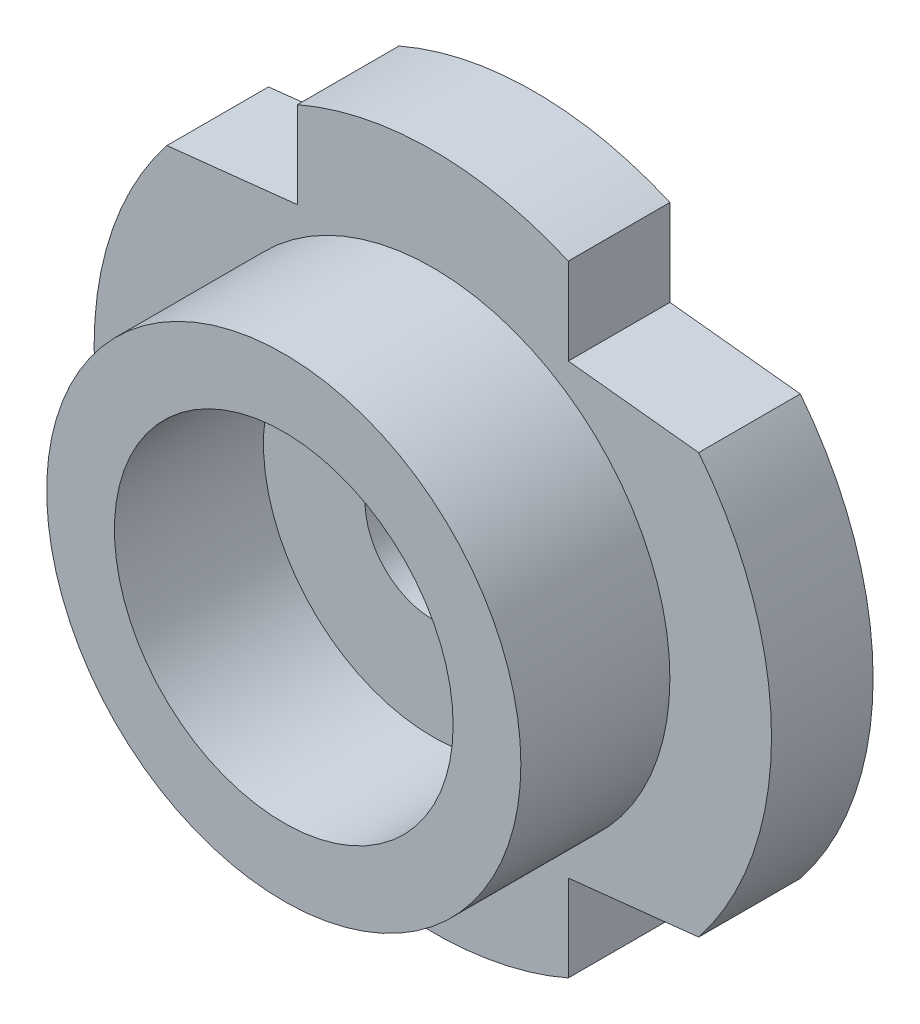
ISO-10303-21;
HEADER;
FILE_DESCRIPTION(('STEP AP214'),'2;1');
FILE_NAME('part.step','',(''),(''),'','','');
FILE_SCHEMA(('AUTOMOTIVE_DESIGN { 1 0 10303 214 1 1 1 1 }'));
ENDSEC;
DATA;
#1=APPLICATION_CONTEXT('core data for automotive mechanical design processes');
#2=APPLICATION_PROTOCOL_DEFINITION('international standard','automotive_design',2000,#1);
#3=PRODUCT_CONTEXT('',#1,'mechanical');
#4=PRODUCT('Part','Part','',(#3));
#5=PRODUCT_RELATED_PRODUCT_CATEGORY('part','',(#4));
#6=PRODUCT_DEFINITION_FORMATION('','',#4);
#7=PRODUCT_DEFINITION_CONTEXT('part definition',#1,'design');
#8=PRODUCT_DEFINITION('design','',#6,#7);
#9=PRODUCT_DEFINITION_SHAPE('','',#8);
#10=(LENGTH_UNIT() NAMED_UNIT(*) SI_UNIT(.MILLI.,.METRE.));
#11=(NAMED_UNIT(*) PLANE_ANGLE_UNIT() SI_UNIT($,.RADIAN.));
#12=(NAMED_UNIT(*) SI_UNIT($,.STERADIAN.) SOLID_ANGLE_UNIT());
#13=UNCERTAINTY_MEASURE_WITH_UNIT(LENGTH_MEASURE(1.E-05),#10,'distance_accuracy_value','');
#14=(GEOMETRIC_REPRESENTATION_CONTEXT(3) GLOBAL_UNCERTAINTY_ASSIGNED_CONTEXT((#13)) GLOBAL_UNIT_ASSIGNED_CONTEXT((#10,
#11,#12)) REPRESENTATION_CONTEXT('',''));
#15=CARTESIAN_POINT('',(0.,0.,0.));
#16=DIRECTION('',(0.,0.,1.));
#17=DIRECTION('',(1.,0.,0.));
#18=AXIS2_PLACEMENT_3D('',#15,#16,#17);
#19=CARTESIAN_POINT('',(-2.,-7.75863864960814,1.5));
#20=DIRECTION('',(1.,0.,0.));
#21=DIRECTION('',(0.,1.,0.));
#22=AXIS2_PLACEMENT_3D('',#19,#20,#21);
#23=PLANE('',#22);
#24=DIRECTION('',(0.,0.,1.));
#25=VECTOR('',#24,1.);
#26=CARTESIAN_POINT('',(-2.,-4.58257569495584,-0.000999999999999916));
#27=LINE('',#26,#25);
#28=CARTESIAN_POINT('',(-2.,-4.58257569495584,0.));
#29=VERTEX_POINT('',#28);
#30=CARTESIAN_POINT('',(-2.,-4.58257569495584,1.5));
#31=VERTEX_POINT('',#30);
#32=EDGE_CURVE('E124',#29,#31,#27,.T.);
#33=ORIENTED_EDGE('',*,*,#32,.T.);
#34=DIRECTION('',(0.,-1.,0.));
#35=VECTOR('',#34,1.);
#36=CARTESIAN_POINT('',(-2.,-7.75863864960814,1.5));
#37=LINE('',#36,#35);
#38=CARTESIAN_POINT('',(-2.,-3.30473755729266,1.5));
#39=VERTEX_POINT('',#38);
#40=EDGE_CURVE('E238',#39,#31,#37,.T.);
#41=ORIENTED_EDGE('',*,*,#40,.F.);
#42=DIRECTION('',(0.,0.,-1.));
#43=VECTOR('',#42,1.);
#44=CARTESIAN_POINT('',(-2.,-3.30473755729266,1.5));
#45=LINE('',#44,#43);
#46=CARTESIAN_POINT('',(-2.,-3.30473755729266,0.));
#47=VERTEX_POINT('',#46);
#48=EDGE_CURVE('E145',#39,#47,#45,.T.);
#49=ORIENTED_EDGE('',*,*,#48,.T.);
#50=DIRECTION('',(0.,-1.,0.));
#51=VECTOR('',#50,1.);
#52=CARTESIAN_POINT('',(-2.,-7.75863864960814,0.));
#53=LINE('',#52,#51);
#54=EDGE_CURVE('E139',#47,#29,#53,.T.);
#55=ORIENTED_EDGE('',*,*,#54,.T.);
#56=EDGE_LOOP('',(#33,#41,#49,#55));
#57=FACE_BOUND('',#56,.T.);
#58=ADVANCED_FACE('F36',(#57),#23,.F.);
#59=CARTESIAN_POINT('',(2.,-7.75863864960814,1.5));
#60=DIRECTION('',(-1.,0.,0.));
#61=DIRECTION('',(0.,-1.,0.));
#62=AXIS2_PLACEMENT_3D('',#59,#60,#61);
#63=PLANE('',#62);
#64=DIRECTION('',(0.,0.,1.));
#65=VECTOR('',#64,1.);
#66=CARTESIAN_POINT('',(2.,-4.58257569495584,-0.000999999999999916));
#67=LINE('',#66,#65);
#68=CARTESIAN_POINT('',(2.,-4.58257569495584,1.5));
#69=VERTEX_POINT('',#68);
#70=CARTESIAN_POINT('',(2.,-4.58257569495584,0.));
#71=VERTEX_POINT('',#70);
#72=EDGE_CURVE('E258',#69,#71,#67,.F.);
#73=ORIENTED_EDGE('',*,*,#72,.T.);
#74=DIRECTION('',(0.,1.,0.));
#75=VECTOR('',#74,1.);
#76=CARTESIAN_POINT('',(2.,-7.75863864960814,0.));
#77=LINE('',#76,#75);
#78=CARTESIAN_POINT('',(2.,-3.30473755729266,0.));
#79=VERTEX_POINT('',#78);
#80=EDGE_CURVE('E141',#71,#79,#77,.T.);
#81=ORIENTED_EDGE('',*,*,#80,.T.);
#82=DIRECTION('',(0.,0.,-1.));
#83=VECTOR('',#82,1.);
#84=CARTESIAN_POINT('',(2.,-3.30473755729266,1.5));
#85=LINE('',#84,#83);
#86=CARTESIAN_POINT('',(2.,-3.30473755729266,1.5));
#87=VERTEX_POINT('',#86);
#88=EDGE_CURVE('E157',#87,#79,#85,.T.);
#89=ORIENTED_EDGE('',*,*,#88,.F.);
#90=DIRECTION('',(0.,1.,0.));
#91=VECTOR('',#90,1.);
#92=CARTESIAN_POINT('',(2.,-7.75863864960814,1.5));
#93=LINE('',#92,#91);
#94=EDGE_CURVE('E240',#69,#87,#93,.T.);
#95=ORIENTED_EDGE('',*,*,#94,.F.);
#96=EDGE_LOOP('',(#73,#81,#89,#95));
#97=FACE_BOUND('',#96,.T.);
#98=ADVANCED_FACE('F273',(#97),#63,.F.);
#99=CARTESIAN_POINT('',(14.,0.,1.5));
#100=DIRECTION('',(0.,0.,1.));
#101=DIRECTION('',(1.,0.,0.));
#102=AXIS2_PLACEMENT_3D('',#99,#100,#101);
#103=PLANE('',#102);
#104=CARTESIAN_POINT('',(0.,0.,1.5));
#105=DIRECTION('',(0.,0.,1.));
#106=DIRECTION('',(1.,0.,0.));
#107=AXIS2_PLACEMENT_3D('',#104,#105,#106);
#108=CIRCLE('',#107,3.5);
#109=CARTESIAN_POINT('',(3.5,0.,1.5));
#110=VERTEX_POINT('',#109);
#111=EDGE_CURVE('E225',#110,#110,#108,.T.);
#112=ORIENTED_EDGE('',*,*,#111,.F.);
#113=EDGE_LOOP('',(#112));
#114=FACE_BOUND('',#113,.T.);
#115=ORIENTED_EDGE('',*,*,#40,.T.);
#116=CARTESIAN_POINT('',(0.,0.,1.5));
#117=DIRECTION('',(0.,0.,1.));
#118=DIRECTION('',(1.,0.,0.));
#119=AXIS2_PLACEMENT_3D('',#116,#117,#118);
#120=CIRCLE('',#119,5.);
#121=EDGE_CURVE('E127',#31,#69,#120,.T.);
#122=ORIENTED_EDGE('',*,*,#121,.T.);
#123=ORIENTED_EDGE('',*,*,#94,.T.);
#124=DIRECTION('',(0.994243636219647,0.107142857142857,0.));
#125=VECTOR('',#124,1.);
#126=CARTESIAN_POINT('',(2.,-3.30473755729266,1.5));
#127=LINE('',#126,#125);
#128=CARTESIAN_POINT('',(3.9251598842984,-3.09727620381111,1.5));
#129=VERTEX_POINT('',#128);
#130=EDGE_CURVE('E160',#87,#129,#127,.T.);
#131=ORIENTED_EDGE('',*,*,#130,.T.);
#132=CARTESIAN_POINT('',(0.,0.,1.5));
#133=DIRECTION('',(0.,0.,1.));
#134=DIRECTION('',(1.,0.,0.));
#135=AXIS2_PLACEMENT_3D('',#132,#133,#134);
#136=CIRCLE('',#135,5.);
#137=CARTESIAN_POINT('',(3.9251598842984,3.09727620381111,1.5));
#138=VERTEX_POINT('',#137);
#139=EDGE_CURVE('E60',#129,#138,#136,.T.);
#140=ORIENTED_EDGE('',*,*,#139,.T.);
#141=DIRECTION('',(-0.994243636219647,0.107142857142857,0.));
#142=VECTOR('',#141,1.);
#143=CARTESIAN_POINT('',(2.,3.30473755729266,1.5));
#144=LINE('',#143,#142);
#145=CARTESIAN_POINT('',(2.,3.30473755729266,1.5));
#146=VERTEX_POINT('',#145);
#147=EDGE_CURVE('E156',#138,#146,#144,.T.);
#148=ORIENTED_EDGE('',*,*,#147,.T.);
#149=DIRECTION('',(0.,1.,0.));
#150=VECTOR('',#149,1.);
#151=CARTESIAN_POINT('',(2.,7.75863864960814,1.5));
#152=LINE('',#151,#150);
#153=CARTESIAN_POINT('',(2.,4.58257569495584,1.5));
#154=VERTEX_POINT('',#153);
#155=EDGE_CURVE('E175',#146,#154,#152,.T.);
#156=ORIENTED_EDGE('',*,*,#155,.T.);
#157=CARTESIAN_POINT('',(0.,0.,1.5));
#158=DIRECTION('',(0.,0.,1.));
#159=DIRECTION('',(1.,0.,0.));
#160=AXIS2_PLACEMENT_3D('',#157,#158,#159);
#161=CIRCLE('',#160,5.);
#162=CARTESIAN_POINT('',(-2.,4.58257569495584,1.5));
#163=VERTEX_POINT('',#162);
#164=EDGE_CURVE('E261',#154,#163,#161,.T.);
#165=ORIENTED_EDGE('',*,*,#164,.T.);
#166=DIRECTION('',(0.,-1.,0.));
#167=VECTOR('',#166,1.);
#168=CARTESIAN_POINT('',(-2.,7.75863864960814,1.5));
#169=LINE('',#168,#167);
#170=CARTESIAN_POINT('',(-2.,3.30473755729266,1.5));
#171=VERTEX_POINT('',#170);
#172=EDGE_CURVE('E232',#163,#171,#169,.T.);
#173=ORIENTED_EDGE('',*,*,#172,.T.);
#174=DIRECTION('',(-0.994243636219647,-0.107142857142857,0.));
#175=VECTOR('',#174,1.);
#176=CARTESIAN_POINT('',(-2.,3.30473755729266,1.5));
#177=LINE('',#176,#175);
#178=CARTESIAN_POINT('',(-3.9251598842984,3.09727620381111,1.5));
#179=VERTEX_POINT('',#178);
#180=EDGE_CURVE('E234',#171,#179,#177,.T.);
#181=ORIENTED_EDGE('',*,*,#180,.T.);
#182=CARTESIAN_POINT('',(0.,0.,1.5));
#183=DIRECTION('',(0.,0.,1.));
#184=DIRECTION('',(1.,0.,0.));
#185=AXIS2_PLACEMENT_3D('',#182,#183,#184);
#186=CIRCLE('',#185,5.);
#187=CARTESIAN_POINT('',(-3.9251598842984,-3.09727620381111,1.5));
#188=VERTEX_POINT('',#187);
#189=EDGE_CURVE('E204',#179,#188,#186,.T.);
#190=ORIENTED_EDGE('',*,*,#189,.T.);
#191=DIRECTION('',(0.994243636219647,-0.107142857142857,0.));
#192=VECTOR('',#191,1.);
#193=CARTESIAN_POINT('',(-2.,-3.30473755729266,1.5));
#194=LINE('',#193,#192);
#195=EDGE_CURVE('E236',#188,#39,#194,.T.);
#196=ORIENTED_EDGE('',*,*,#195,.T.);
#197=EDGE_LOOP('',(#115,#122,#123,#131,#140,#148,#156,#165,#173,#181,#190,#196));
#198=FACE_BOUND('',#197,.T.);
#199=ADVANCED_FACE('F244',(#114,#198),#103,.T.);
#200=CARTESIAN_POINT('',(14.,0.,0.));
#201=DIRECTION('',(0.,0.,1.));
#202=DIRECTION('',(1.,0.,0.));
#203=AXIS2_PLACEMENT_3D('',#200,#201,#202);
#204=PLANE('',#203);
#205=CARTESIAN_POINT('',(0.,0.,0.));
#206=DIRECTION('',(0.,0.,1.));
#207=DIRECTION('',(1.,0.,0.));
#208=AXIS2_PLACEMENT_3D('',#205,#206,#207);
#209=CIRCLE('',#208,5.);
#210=EDGE_CURVE('E52',#71,#29,#209,.F.);
#211=ORIENTED_EDGE('',*,*,#210,.T.);
#212=ORIENTED_EDGE('',*,*,#54,.F.);
#213=DIRECTION('',(0.994243636219647,-0.107142857142857,0.));
#214=VECTOR('',#213,1.);
#215=CARTESIAN_POINT('',(-2.,-3.30473755729266,0.));
#216=LINE('',#215,#214);
#217=CARTESIAN_POINT('',(-3.9251598842984,-3.09727620381111,0.));
#218=VERTEX_POINT('',#217);
#219=EDGE_CURVE('E146',#218,#47,#216,.T.);
#220=ORIENTED_EDGE('',*,*,#219,.F.);
#221=CARTESIAN_POINT('',(0.,0.,0.));
#222=DIRECTION('',(0.,0.,1.));
#223=DIRECTION('',(1.,0.,0.));
#224=AXIS2_PLACEMENT_3D('',#221,#222,#223);
#225=CIRCLE('',#224,5.);
#226=CARTESIAN_POINT('',(-3.9251598842984,3.09727620381111,0.));
#227=VERTEX_POINT('',#226);
#228=EDGE_CURVE('E200',#218,#227,#225,.F.);
#229=ORIENTED_EDGE('',*,*,#228,.T.);
#230=DIRECTION('',(-0.994243636219647,-0.107142857142857,0.));
#231=VECTOR('',#230,1.);
#232=CARTESIAN_POINT('',(-2.,3.30473755729266,0.));
#233=LINE('',#232,#231);
#234=CARTESIAN_POINT('',(-2.,3.30473755729266,0.));
#235=VERTEX_POINT('',#234);
#236=EDGE_CURVE('E150',#235,#227,#233,.T.);
#237=ORIENTED_EDGE('',*,*,#236,.F.);
#238=DIRECTION('',(0.,-1.,0.));
#239=VECTOR('',#238,1.);
#240=CARTESIAN_POINT('',(-2.,7.75863864960814,0.));
#241=LINE('',#240,#239);
#242=CARTESIAN_POINT('',(-2.,4.58257569495584,0.));
#243=VERTEX_POINT('',#242);
#244=EDGE_CURVE('E184',#243,#235,#241,.T.);
#245=ORIENTED_EDGE('',*,*,#244,.F.);
#246=CARTESIAN_POINT('',(0.,0.,0.));
#247=DIRECTION('',(0.,0.,1.));
#248=DIRECTION('',(1.,0.,0.));
#249=AXIS2_PLACEMENT_3D('',#246,#247,#248);
#250=CIRCLE('',#249,5.);
#251=CARTESIAN_POINT('',(2.,4.58257569495584,0.));
#252=VERTEX_POINT('',#251);
#253=EDGE_CURVE('E183',#243,#252,#250,.F.);
#254=ORIENTED_EDGE('',*,*,#253,.T.);
#255=DIRECTION('',(0.,1.,0.));
#256=VECTOR('',#255,1.);
#257=CARTESIAN_POINT('',(2.,7.75863864960814,0.));
#258=LINE('',#257,#256);
#259=CARTESIAN_POINT('',(2.,3.30473755729266,0.));
#260=VERTEX_POINT('',#259);
#261=EDGE_CURVE('E173',#260,#252,#258,.T.);
#262=ORIENTED_EDGE('',*,*,#261,.F.);
#263=DIRECTION('',(-0.994243636219647,0.107142857142857,0.));
#264=VECTOR('',#263,1.);
#265=CARTESIAN_POINT('',(2.,3.30473755729266,0.));
#266=LINE('',#265,#264);
#267=CARTESIAN_POINT('',(3.9251598842984,3.09727620381111,0.));
#268=VERTEX_POINT('',#267);
#269=EDGE_CURVE('E181',#268,#260,#266,.T.);
#270=ORIENTED_EDGE('',*,*,#269,.F.);
#271=CARTESIAN_POINT('',(0.,0.,0.));
#272=DIRECTION('',(0.,0.,1.));
#273=DIRECTION('',(1.,0.,0.));
#274=AXIS2_PLACEMENT_3D('',#271,#272,#273);
#275=CIRCLE('',#274,5.);
#276=CARTESIAN_POINT('',(3.9251598842984,-3.09727620381111,0.));
#277=VERTEX_POINT('',#276);
#278=EDGE_CURVE('E250',#268,#277,#275,.F.);
#279=ORIENTED_EDGE('',*,*,#278,.T.);
#280=DIRECTION('',(0.994243636219647,0.107142857142857,0.));
#281=VECTOR('',#280,1.);
#282=CARTESIAN_POINT('',(2.,-3.30473755729266,0.));
#283=LINE('',#282,#281);
#284=EDGE_CURVE('E148',#79,#277,#283,.T.);
#285=ORIENTED_EDGE('',*,*,#284,.F.);
#286=ORIENTED_EDGE('',*,*,#80,.F.);
#287=EDGE_LOOP('',(#211,#212,#220,#229,#237,#245,#254,#262,#270,#279,#285,#286));
#288=FACE_BOUND('',#287,.T.);
#289=CARTESIAN_POINT('',(0.,0.,0.));
#290=DIRECTION('',(0.,0.,-1.));
#291=DIRECTION('',(-1.,0.,0.));
#292=AXIS2_PLACEMENT_3D('',#289,#290,#291);
#293=CIRCLE('',#292,2.5);
#294=CARTESIAN_POINT('',(-2.5,0.,0.));
#295=VERTEX_POINT('',#294);
#296=EDGE_CURVE('E213',#295,#295,#293,.T.);
#297=ORIENTED_EDGE('',*,*,#296,.F.);
#298=EDGE_LOOP('',(#297));
#299=FACE_BOUND('',#298,.T.);
#300=ADVANCED_FACE('F136',(#288,#299),#204,.F.);
#301=CARTESIAN_POINT('',(2.,3.30473755729266,1.5));
#302=DIRECTION('',(-0.107142857142857,-0.994243636219647,0.));
#303=DIRECTION('',(0.994243636219647,-0.107142857142857,0.));
#304=AXIS2_PLACEMENT_3D('',#301,#302,#303);
#305=PLANE('',#304);
#306=DIRECTION('',(0.,0.,1.));
#307=VECTOR('',#306,1.);
#308=CARTESIAN_POINT('',(3.9251598842984,3.09727620381111,-0.000999999999999916));
#309=LINE('',#308,#307);
#310=EDGE_CURVE('E253',#138,#268,#309,.F.);
#311=ORIENTED_EDGE('',*,*,#310,.T.);
#312=ORIENTED_EDGE('',*,*,#269,.T.);
#313=DIRECTION('',(0.,0.,-1.));
#314=VECTOR('',#313,1.);
#315=CARTESIAN_POINT('',(2.,3.30473755729266,1.5));
#316=LINE('',#315,#314);
#317=EDGE_CURVE('E45',#146,#260,#316,.T.);
#318=ORIENTED_EDGE('',*,*,#317,.F.);
#319=ORIENTED_EDGE('',*,*,#147,.F.);
#320=EDGE_LOOP('',(#311,#312,#318,#319));
#321=FACE_BOUND('',#320,.T.);
#322=ADVANCED_FACE('F38',(#321),#305,.F.);
#323=CARTESIAN_POINT('',(2.,-3.30473755729266,1.5));
#324=DIRECTION('',(-0.107142857142857,0.994243636219647,0.));
#325=DIRECTION('',(-0.994243636219647,-0.107142857142857,0.));
#326=AXIS2_PLACEMENT_3D('',#323,#324,#325);
#327=PLANE('',#326);
#328=DIRECTION('',(0.,0.,1.));
#329=VECTOR('',#328,1.);
#330=CARTESIAN_POINT('',(3.9251598842984,-3.09727620381111,-0.000999999999999916));
#331=LINE('',#330,#329);
#332=EDGE_CURVE('E249',#277,#129,#331,.T.);
#333=ORIENTED_EDGE('',*,*,#332,.T.);
#334=ORIENTED_EDGE('',*,*,#130,.F.);
#335=ORIENTED_EDGE('',*,*,#88,.T.);
#336=ORIENTED_EDGE('',*,*,#284,.T.);
#337=EDGE_LOOP('',(#333,#334,#335,#336));
#338=FACE_BOUND('',#337,.T.);
#339=ADVANCED_FACE('F248',(#338),#327,.F.);
#340=CARTESIAN_POINT('',(2.,7.75863864960814,1.5));
#341=DIRECTION('',(-1.,0.,0.));
#342=DIRECTION('',(0.,-1.,0.));
#343=AXIS2_PLACEMENT_3D('',#340,#341,#342);
#344=PLANE('',#343);
#345=DIRECTION('',(0.,0.,1.));
#346=VECTOR('',#345,1.);
#347=CARTESIAN_POINT('',(2.,4.58257569495584,-0.000999999999999916));
#348=LINE('',#347,#346);
#349=EDGE_CURVE('E252',#252,#154,#348,.T.);
#350=ORIENTED_EDGE('',*,*,#349,.T.);
#351=ORIENTED_EDGE('',*,*,#155,.F.);
#352=ORIENTED_EDGE('',*,*,#317,.T.);
#353=ORIENTED_EDGE('',*,*,#261,.T.);
#354=EDGE_LOOP('',(#350,#351,#352,#353));
#355=FACE_BOUND('',#354,.T.);
#356=ADVANCED_FACE('F172',(#355),#344,.F.);
#357=CARTESIAN_POINT('',(-2.,7.75863864960814,1.5));
#358=DIRECTION('',(1.,0.,0.));
#359=DIRECTION('',(0.,1.,0.));
#360=AXIS2_PLACEMENT_3D('',#357,#358,#359);
#361=PLANE('',#360);
#362=DIRECTION('',(0.,0.,1.));
#363=VECTOR('',#362,1.);
#364=CARTESIAN_POINT('',(-2.,4.58257569495584,-0.000999999999999916));
#365=LINE('',#364,#363);
#366=EDGE_CURVE('E208',#163,#243,#365,.F.);
#367=ORIENTED_EDGE('',*,*,#366,.T.);
#368=ORIENTED_EDGE('',*,*,#244,.T.);
#369=DIRECTION('',(0.,0.,-1.));
#370=VECTOR('',#369,1.);
#371=CARTESIAN_POINT('',(-2.,3.30473755729266,1.5));
#372=LINE('',#371,#370);
#373=EDGE_CURVE('E162',#171,#235,#372,.T.);
#374=ORIENTED_EDGE('',*,*,#373,.F.);
#375=ORIENTED_EDGE('',*,*,#172,.F.);
#376=EDGE_LOOP('',(#367,#368,#374,#375));
#377=FACE_BOUND('',#376,.T.);
#378=ADVANCED_FACE('F268',(#377),#361,.F.);
#379=CARTESIAN_POINT('',(-2.,3.30473755729266,1.5));
#380=DIRECTION('',(0.107142857142857,-0.994243636219647,0.));
#381=DIRECTION('',(0.994243636219647,0.107142857142857,0.));
#382=AXIS2_PLACEMENT_3D('',#379,#380,#381);
#383=PLANE('',#382);
#384=DIRECTION('',(0.,0.,1.));
#385=VECTOR('',#384,1.);
#386=CARTESIAN_POINT('',(-3.9251598842984,3.09727620381111,-0.000999999999999916));
#387=LINE('',#386,#385);
#388=EDGE_CURVE('E196',#227,#179,#387,.T.);
#389=ORIENTED_EDGE('',*,*,#388,.T.);
#390=ORIENTED_EDGE('',*,*,#180,.F.);
#391=ORIENTED_EDGE('',*,*,#373,.T.);
#392=ORIENTED_EDGE('',*,*,#236,.T.);
#393=EDGE_LOOP('',(#389,#390,#391,#392));
#394=FACE_BOUND('',#393,.T.);
#395=ADVANCED_FACE('F194',(#394),#383,.F.);
#396=CARTESIAN_POINT('',(-2.,-3.30473755729266,1.5));
#397=DIRECTION('',(0.107142857142857,0.994243636219647,0.));
#398=DIRECTION('',(-0.994243636219647,0.107142857142857,0.));
#399=AXIS2_PLACEMENT_3D('',#396,#397,#398);
#400=PLANE('',#399);
#401=DIRECTION('',(0.,0.,1.));
#402=VECTOR('',#401,1.);
#403=CARTESIAN_POINT('',(-3.9251598842984,-3.09727620381111,-0.000999999999999916));
#404=LINE('',#403,#402);
#405=EDGE_CURVE('E203',#188,#218,#404,.F.);
#406=ORIENTED_EDGE('',*,*,#405,.T.);
#407=ORIENTED_EDGE('',*,*,#219,.T.);
#408=ORIENTED_EDGE('',*,*,#48,.F.);
#409=ORIENTED_EDGE('',*,*,#195,.F.);
#410=EDGE_LOOP('',(#406,#407,#408,#409));
#411=FACE_BOUND('',#410,.T.);
#412=ADVANCED_FACE('F271',(#411),#400,.F.);
#413=CARTESIAN_POINT('',(0.,0.,-0.000999999999999916));
#414=DIRECTION('',(0.,0.,1.));
#415=DIRECTION('',(1.,0.,0.));
#416=AXIS2_PLACEMENT_3D('',#413,#414,#415);
#417=CYLINDRICAL_SURFACE('',#416,1.);
#418=CARTESIAN_POINT('',(0.,0.,1.5));
#419=DIRECTION('',(0.,0.,1.));
#420=DIRECTION('',(1.,0.,0.));
#421=AXIS2_PLACEMENT_3D('',#418,#419,#420);
#422=CIRCLE('',#421,1.);
#423=CARTESIAN_POINT('',(1.,0.,1.5));
#424=VERTEX_POINT('',#423);
#425=EDGE_CURVE('E219',#424,#424,#422,.T.);
#426=ORIENTED_EDGE('',*,*,#425,.T.);
#427=EDGE_LOOP('',(#426));
#428=FACE_BOUND('',#427,.T.);
#429=CARTESIAN_POINT('',(0.,0.,1.));
#430=DIRECTION('',(0.,0.,-1.));
#431=DIRECTION('',(-1.,0.,0.));
#432=AXIS2_PLACEMENT_3D('',#429,#430,#431);
#433=CIRCLE('',#432,1.);
#434=CARTESIAN_POINT('',(-1.,0.,1.));
#435=VERTEX_POINT('',#434);
#436=EDGE_CURVE('E40',#435,#435,#433,.F.);
#437=ORIENTED_EDGE('',*,*,#436,.F.);
#438=EDGE_LOOP('',(#437));
#439=FACE_BOUND('',#438,.T.);
#440=ADVANCED_FACE('F290',(#428,#439),#417,.F.);
#441=CARTESIAN_POINT('',(0.,0.,3.7));
#442=DIRECTION('',(0.,0.,1.));
#443=DIRECTION('',(1.,0.,0.));
#444=AXIS2_PLACEMENT_3D('',#441,#442,#443);
#445=PLANE('',#444);
#446=CARTESIAN_POINT('',(0.,0.,3.7));
#447=DIRECTION('',(0.,0.,1.));
#448=DIRECTION('',(1.,0.,0.));
#449=AXIS2_PLACEMENT_3D('',#446,#447,#448);
#450=CIRCLE('',#449,3.5);
#451=CARTESIAN_POINT('',(3.5,0.,3.7));
#452=VERTEX_POINT('',#451);
#453=EDGE_CURVE('E187',#452,#452,#450,.T.);
#454=ORIENTED_EDGE('',*,*,#453,.T.);
#455=EDGE_LOOP('',(#454));
#456=FACE_BOUND('',#455,.T.);
#457=CARTESIAN_POINT('',(0.,0.,3.7));
#458=DIRECTION('',(0.,0.,1.));
#459=DIRECTION('',(1.,0.,0.));
#460=AXIS2_PLACEMENT_3D('',#457,#458,#459);
#461=CIRCLE('',#460,2.5);
#462=CARTESIAN_POINT('',(2.5,0.,3.7));
#463=VERTEX_POINT('',#462);
#464=EDGE_CURVE('E222',#463,#463,#461,.T.);
#465=ORIENTED_EDGE('',*,*,#464,.F.);
#466=EDGE_LOOP('',(#465));
#467=FACE_BOUND('',#466,.T.);
#468=ADVANCED_FACE('F329',(#456,#467),#445,.T.);
#469=CARTESIAN_POINT('',(0.,0.,3.7));
#470=DIRECTION('',(0.,0.,-1.));
#471=DIRECTION('',(-1.,0.,0.));
#472=AXIS2_PLACEMENT_3D('',#469,#470,#471);
#473=CYLINDRICAL_SURFACE('',#472,3.5);
#474=ORIENTED_EDGE('',*,*,#453,.F.);
#475=EDGE_LOOP('',(#474));
#476=FACE_BOUND('',#475,.T.);
#477=ORIENTED_EDGE('',*,*,#111,.T.);
#478=EDGE_LOOP('',(#477));
#479=FACE_BOUND('',#478,.T.);
#480=ADVANCED_FACE('F334',(#476,#479),#473,.T.);
#481=CARTESIAN_POINT('',(0.,0.,3.7));
#482=DIRECTION('',(0.,0.,-1.));
#483=DIRECTION('',(-1.,0.,0.));
#484=AXIS2_PLACEMENT_3D('',#481,#482,#483);
#485=CYLINDRICAL_SURFACE('',#484,2.5);
#486=ORIENTED_EDGE('',*,*,#464,.T.);
#487=EDGE_LOOP('',(#486));
#488=FACE_BOUND('',#487,.T.);
#489=CARTESIAN_POINT('',(0.,0.,1.5));
#490=DIRECTION('',(0.,0.,1.));
#491=DIRECTION('',(1.,0.,0.));
#492=AXIS2_PLACEMENT_3D('',#489,#490,#491);
#493=CIRCLE('',#492,2.5);
#494=CARTESIAN_POINT('',(2.5,0.,1.5));
#495=VERTEX_POINT('',#494);
#496=EDGE_CURVE('E11',#495,#495,#493,.F.);
#497=ORIENTED_EDGE('',*,*,#496,.T.);
#498=EDGE_LOOP('',(#497));
#499=FACE_BOUND('',#498,.T.);
#500=ADVANCED_FACE('F331',(#488,#499),#485,.F.);
#501=ORIENTED_EDGE('',*,*,#425,.F.);
#502=EDGE_LOOP('',(#501));
#503=FACE_BOUND('',#502,.T.);
#504=ORIENTED_EDGE('',*,*,#496,.F.);
#505=EDGE_LOOP('',(#504));
#506=FACE_BOUND('',#505,.T.);
#507=ADVANCED_FACE('F283',(#503,#506),#103,.T.);
#508=CARTESIAN_POINT('',(0.,0.,1.));
#509=DIRECTION('',(0.,0.,-1.));
#510=DIRECTION('',(-1.,0.,0.));
#511=AXIS2_PLACEMENT_3D('',#508,#509,#510);
#512=PLANE('',#511);
#513=CARTESIAN_POINT('',(0.,0.,1.));
#514=DIRECTION('',(0.,0.,-1.));
#515=DIRECTION('',(-1.,0.,0.));
#516=AXIS2_PLACEMENT_3D('',#513,#514,#515);
#517=CIRCLE('',#516,2.5);
#518=CARTESIAN_POINT('',(-2.5,0.,1.));
#519=VERTEX_POINT('',#518);
#520=EDGE_CURVE('E214',#519,#519,#517,.T.);
#521=ORIENTED_EDGE('',*,*,#520,.T.);
#522=EDGE_LOOP('',(#521));
#523=FACE_BOUND('',#522,.T.);
#524=ORIENTED_EDGE('',*,*,#436,.T.);
#525=EDGE_LOOP('',(#524));
#526=FACE_BOUND('',#525,.T.);
#527=ADVANCED_FACE('F320',(#523,#526),#512,.T.);
#528=CARTESIAN_POINT('',(0.,0.,1.));
#529=DIRECTION('',(0.,0.,-1.));
#530=DIRECTION('',(-1.,0.,0.));
#531=AXIS2_PLACEMENT_3D('',#528,#529,#530);
#532=CYLINDRICAL_SURFACE('',#531,2.5);
#533=ORIENTED_EDGE('',*,*,#520,.F.);
#534=EDGE_LOOP('',(#533));
#535=FACE_BOUND('',#534,.T.);
#536=ORIENTED_EDGE('',*,*,#296,.T.);
#537=EDGE_LOOP('',(#536));
#538=FACE_BOUND('',#537,.T.);
#539=ADVANCED_FACE('F319',(#535,#538),#532,.F.);
#540=CARTESIAN_POINT('',(0.,0.,-0.000999999999999916));
#541=DIRECTION('',(0.,0.,1.));
#542=DIRECTION('',(1.,0.,0.));
#543=AXIS2_PLACEMENT_3D('',#540,#541,#542);
#544=CYLINDRICAL_SURFACE('',#543,5.);
#545=ORIENTED_EDGE('',*,*,#228,.F.);
#546=ORIENTED_EDGE('',*,*,#405,.F.);
#547=ORIENTED_EDGE('',*,*,#189,.F.);
#548=ORIENTED_EDGE('',*,*,#388,.F.);
#549=EDGE_LOOP('',(#545,#546,#547,#548));
#550=FACE_BOUND('',#549,.T.);
#551=ADVANCED_FACE('F314',(#550),#544,.T.);
#552=CARTESIAN_POINT('',(0.,0.,-0.000999999999999916));
#553=DIRECTION('',(0.,0.,1.));
#554=DIRECTION('',(1.,0.,0.));
#555=AXIS2_PLACEMENT_3D('',#552,#553,#554);
#556=CYLINDRICAL_SURFACE('',#555,5.);
#557=ORIENTED_EDGE('',*,*,#253,.F.);
#558=ORIENTED_EDGE('',*,*,#366,.F.);
#559=ORIENTED_EDGE('',*,*,#164,.F.);
#560=ORIENTED_EDGE('',*,*,#349,.F.);
#561=EDGE_LOOP('',(#557,#558,#559,#560));
#562=FACE_BOUND('',#561,.T.);
#563=ADVANCED_FACE('F307',(#562),#556,.T.);
#564=CARTESIAN_POINT('',(0.,0.,-0.000999999999999916));
#565=DIRECTION('',(0.,0.,1.));
#566=DIRECTION('',(1.,0.,0.));
#567=AXIS2_PLACEMENT_3D('',#564,#565,#566);
#568=CYLINDRICAL_SURFACE('',#567,5.);
#569=ORIENTED_EDGE('',*,*,#139,.F.);
#570=ORIENTED_EDGE('',*,*,#332,.F.);
#571=ORIENTED_EDGE('',*,*,#278,.F.);
#572=ORIENTED_EDGE('',*,*,#310,.F.);
#573=EDGE_LOOP('',(#569,#570,#571,#572));
#574=FACE_BOUND('',#573,.T.);
#575=ADVANCED_FACE('F305',(#574),#568,.T.);
#576=CARTESIAN_POINT('',(0.,0.,-0.000999999999999916));
#577=DIRECTION('',(0.,0.,1.));
#578=DIRECTION('',(1.,0.,0.));
#579=AXIS2_PLACEMENT_3D('',#576,#577,#578);
#580=CYLINDRICAL_SURFACE('',#579,5.);
#581=ORIENTED_EDGE('',*,*,#210,.F.);
#582=ORIENTED_EDGE('',*,*,#72,.F.);
#583=ORIENTED_EDGE('',*,*,#121,.F.);
#584=ORIENTED_EDGE('',*,*,#32,.F.);
#585=EDGE_LOOP('',(#581,#582,#583,#584));
#586=FACE_BOUND('',#585,.T.);
#587=ADVANCED_FACE('F125',(#586),#580,.T.);
#588=CLOSED_SHELL('',(#58,#98,#199,#300,#322,#339,#356,#378,#395,#412,#440,#468,#480,#500,#507,
#527,#539,#551,#563,#575,#587));
#589=MANIFOLD_SOLID_BREP('B2',#588);
#590=ADVANCED_BREP_SHAPE_REPRESENTATION('',(#18,#589),#14);
#591=SHAPE_DEFINITION_REPRESENTATION(#9,#590);
ENDSEC;
END-ISO-10303-21;
